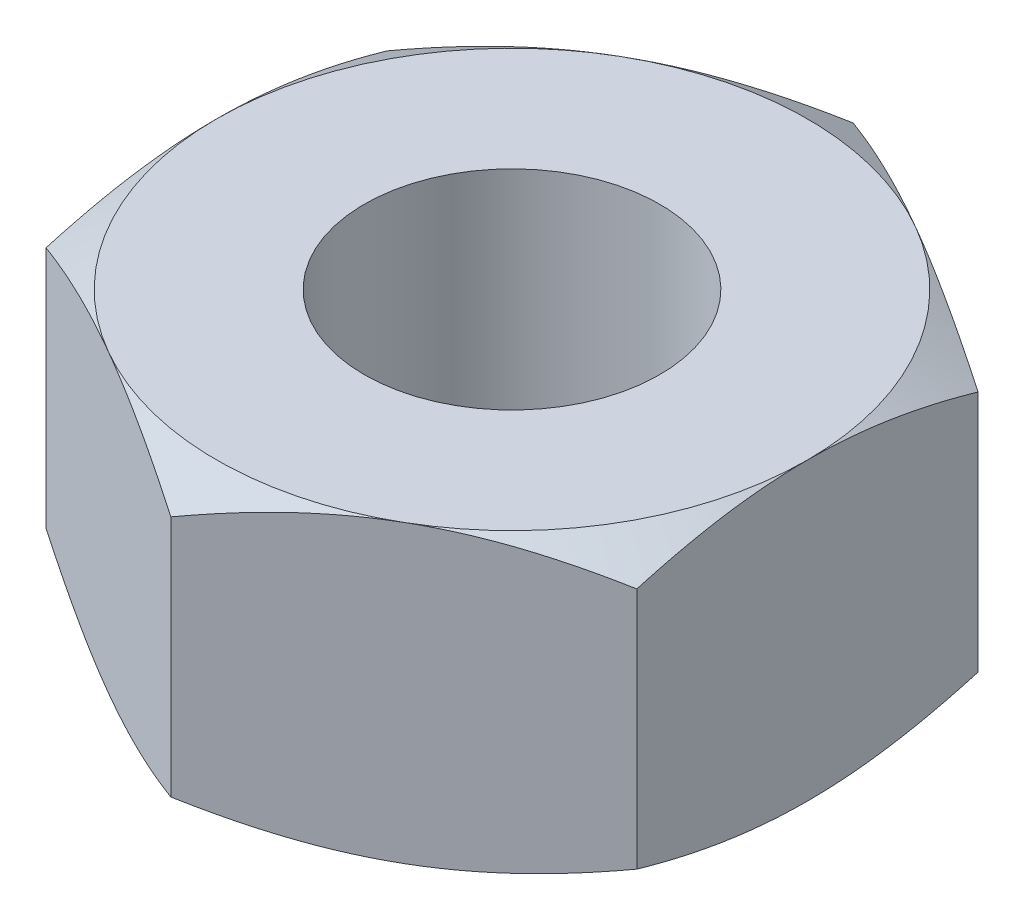
ISO-10303-21;
HEADER;
FILE_DESCRIPTION(('STEP AP214'),'2;1');
FILE_NAME('part.step','',(''),(''),'','','');
FILE_SCHEMA(('AUTOMOTIVE_DESIGN { 1 0 10303 214 1 1 1 1 }'));
ENDSEC;
DATA;
#1=APPLICATION_CONTEXT('core data for automotive mechanical design processes');
#2=APPLICATION_PROTOCOL_DEFINITION('international standard','automotive_design',2000,#1);
#3=PRODUCT_CONTEXT('',#1,'mechanical');
#4=PRODUCT('Part','Part','',(#3));
#5=PRODUCT_RELATED_PRODUCT_CATEGORY('part','',(#4));
#6=PRODUCT_DEFINITION_FORMATION('','',#4);
#7=PRODUCT_DEFINITION_CONTEXT('part definition',#1,'design');
#8=PRODUCT_DEFINITION('design','',#6,#7);
#9=PRODUCT_DEFINITION_SHAPE('','',#8);
#10=(LENGTH_UNIT() NAMED_UNIT(*) SI_UNIT(.MILLI.,.METRE.));
#11=(NAMED_UNIT(*) PLANE_ANGLE_UNIT() SI_UNIT($,.RADIAN.));
#12=(NAMED_UNIT(*) SI_UNIT($,.STERADIAN.) SOLID_ANGLE_UNIT());
#13=UNCERTAINTY_MEASURE_WITH_UNIT(LENGTH_MEASURE(1.E-05),#10,'distance_accuracy_value','');
#14=(GEOMETRIC_REPRESENTATION_CONTEXT(3) GLOBAL_UNCERTAINTY_ASSIGNED_CONTEXT((#13)) GLOBAL_UNIT_ASSIGNED_CONTEXT((#10,
#11,#12)) REPRESENTATION_CONTEXT('',''));
#15=CARTESIAN_POINT('',(0.,0.,0.));
#16=DIRECTION('',(0.,0.,1.));
#17=DIRECTION('',(1.,0.,0.));
#18=AXIS2_PLACEMENT_3D('',#15,#16,#17);
#19=CARTESIAN_POINT('',(-2.,1.,-1.15470053837926));
#20=DIRECTION('',(0.,1.,0.));
#21=DIRECTION('',(0.,0.,1.));
#22=AXIS2_PLACEMENT_3D('',#19,#20,#21);
#23=PLANE('',#22);
#24=CARTESIAN_POINT('',(0.,1.,0.));
#25=DIRECTION('',(0.,1.,0.));
#26=DIRECTION('',(0.,0.,1.));
#27=AXIS2_PLACEMENT_3D('',#24,#25,#26);
#28=CIRCLE('',#27,1.);
#29=CARTESIAN_POINT('',(0.,1.,1.));
#30=VERTEX_POINT('',#29);
#31=EDGE_CURVE('E246',#30,#30,#28,.T.);
#32=ORIENTED_EDGE('',*,*,#31,.F.);
#33=EDGE_LOOP('',(#32));
#34=FACE_BOUND('',#33,.T.);
#35=CARTESIAN_POINT('',(0.,1.,0.));
#36=DIRECTION('',(0.,1.,0.));
#37=DIRECTION('',(0.,0.,1.));
#38=AXIS2_PLACEMENT_3D('',#35,#36,#37);
#39=CIRCLE('',#38,2.);
#40=CARTESIAN_POINT('',(-0.999999999999999,1.,1.73205080756887));
#41=VERTEX_POINT('',#40);
#42=CARTESIAN_POINT('',(0.999999999999998,1.,1.73205080756887));
#43=VERTEX_POINT('',#42);
#44=EDGE_CURVE('E305',#41,#43,#39,.T.);
#45=ORIENTED_EDGE('',*,*,#44,.T.);
#46=CARTESIAN_POINT('',(2.,1.,0.));
#47=VERTEX_POINT('',#46);
#48=EDGE_CURVE('E308',#43,#47,#39,.T.);
#49=ORIENTED_EDGE('',*,*,#48,.T.);
#50=CARTESIAN_POINT('',(1.,1.,-1.73205080756888));
#51=VERTEX_POINT('',#50);
#52=EDGE_CURVE('E315',#47,#51,#39,.T.);
#53=ORIENTED_EDGE('',*,*,#52,.T.);
#54=CARTESIAN_POINT('',(-1.,1.,-1.73205080756888));
#55=VERTEX_POINT('',#54);
#56=EDGE_CURVE('E319',#51,#55,#39,.T.);
#57=ORIENTED_EDGE('',*,*,#56,.T.);
#58=CARTESIAN_POINT('',(-2.,1.,0.));
#59=VERTEX_POINT('',#58);
#60=EDGE_CURVE('E312',#55,#59,#39,.T.);
#61=ORIENTED_EDGE('',*,*,#60,.T.);
#62=EDGE_CURVE('E307',#59,#41,#39,.T.);
#63=ORIENTED_EDGE('',*,*,#62,.T.);
#64=EDGE_LOOP('',(#45,#49,#53,#57,#61,#63));
#65=FACE_BOUND('',#64,.T.);
#66=ADVANCED_FACE('F42',(#34,#65),#23,.T.);
#67=CARTESIAN_POINT('',(0.,1.,-2.30940107675851));
#68=DIRECTION('',(0.5,0.,0.866025403784439));
#69=DIRECTION('',(0.866025403784439,0.,-0.5));
#70=AXIS2_PLACEMENT_3D('',#67,#68,#69);
#71=PLANE('',#70);
#72=DIRECTION('',(0.,-1.,0.));
#73=VECTOR('',#72,1.);
#74=CARTESIAN_POINT('',(0.,1.,-2.30940107675851));
#75=LINE('',#74,#73);
#76=CARTESIAN_POINT('',(0.,0.821367205045916,-2.30940107675851));
#77=VERTEX_POINT('',#76);
#78=CARTESIAN_POINT('',(0.,-0.821367205045917,-2.30940107675851));
#79=VERTEX_POINT('',#78);
#80=EDGE_CURVE('E243',#77,#79,#75,.T.);
#81=ORIENTED_EDGE('',*,*,#80,.T.);
#82=CARTESIAN_POINT('',(0.000200000000000998,-0.8213005333795,-2.30951654681235));
#83=CARTESIAN_POINT('',(-0.0876912629000593,-0.850610463899318,-2.25877250251758));
#84=CARTESIAN_POINT('',(-0.176341194473591,-0.877267148019531,-2.20759044065996));
#85=CARTESIAN_POINT('',(-0.355176246997802,-0.923797508979276,-2.10433997494457));
#86=CARTESIAN_POINT('',(-0.445364546505037,-0.943654723617218,-2.05226973594631));
#87=CARTESIAN_POINT('',(-0.624623385763307,-0.974566535976745,-1.94877459684593));
#88=CARTESIAN_POINT('',(-0.713666338226305,-0.985826848401467,-1.89736562427198));
#89=CARTESIAN_POINT('',(-0.892171397785045,-0.999271337405356,-1.79430568008403));
#90=CARTESIAN_POINT('',(-0.98163285570396,-1.00146664504653,-1.74265508327245));
#91=CARTESIAN_POINT('',(-1.1488083535488,-0.996909010669349,-1.64613626458982));
#92=CARTESIAN_POINT('',(-1.22654737026579,-0.991275125312983,-1.60125362236173));
#93=CARTESIAN_POINT('',(-1.38151891453613,-0.97341610473917,-1.51178075956051));
#94=CARTESIAN_POINT('',(-1.4587509057412,-0.961184863976558,-1.46719084864822));
#95=CARTESIAN_POINT('',(-1.6140421864822,-0.930606563132388,-1.3775333859096));
#96=CARTESIAN_POINT('',(-1.69208181310738,-0.912129832934282,-1.33247718647009));
#97=CARTESIAN_POINT('',(-1.84699686569214,-0.870194481787143,-1.24303693915876));
#98=CARTESIAN_POINT('',(-1.92387427762312,-0.846745719507685,-1.1986517446858));
#99=CARTESIAN_POINT('',(-2.0002,-0.821300533379501,-1.15458506832542));
#100=B_SPLINE_CURVE_WITH_KNOTS('',3,(#82,#83,#84,#85,#86,#87,#88,#89,#90,#91,#92,#93,#94,#95,
#96,#97,#98,#99),.UNSPECIFIED.,.F.,.F.,(4,2,2,2,2,2,2,2,4),(0.,0.317031824695611,
0.634825876346565,0.944753967652638,1.25430138000372,1.52387047293094,1.79368946861029,
2.06949491027634,2.34475850821473),.UNSPECIFIED.);
#101=CARTESIAN_POINT('',(-1.,-1.,-1.73205080756888));
#102=VERTEX_POINT('',#101);
#103=EDGE_CURVE('E65',#79,#102,#100,.T.);
#104=ORIENTED_EDGE('',*,*,#103,.T.);
#105=CARTESIAN_POINT('',(-2.,-0.821367205045955,-1.15470053837931));
#106=VERTEX_POINT('',#105);
#107=EDGE_CURVE('E201',#102,#106,#100,.T.);
#108=ORIENTED_EDGE('',*,*,#107,.T.);
#109=DIRECTION('',(0.,-1.,0.));
#110=VECTOR('',#109,1.);
#111=CARTESIAN_POINT('',(-2.,1.,-1.15470053837926));
#112=LINE('',#111,#110);
#113=CARTESIAN_POINT('',(-2.,0.821367205045955,-1.15470053837931));
#114=VERTEX_POINT('',#113);
#115=EDGE_CURVE('E231',#114,#106,#112,.T.);
#116=ORIENTED_EDGE('',*,*,#115,.F.);
#117=CARTESIAN_POINT('',(0.00020000000000102,0.8213005333795,-2.30951654681235));
#118=CARTESIAN_POINT('',(-0.0876912629000592,0.850610463899318,-2.25877250251758));
#119=CARTESIAN_POINT('',(-0.176341194473591,0.877267148019531,-2.20759044065996));
#120=CARTESIAN_POINT('',(-0.355176246997802,0.923797508979276,-2.10433997494457));
#121=CARTESIAN_POINT('',(-0.445364546505037,0.943654723617218,-2.05226973594631));
#122=CARTESIAN_POINT('',(-0.624623385763307,0.974566535976745,-1.94877459684593));
#123=CARTESIAN_POINT('',(-0.713666338226305,0.985826848401467,-1.89736562427198));
#124=CARTESIAN_POINT('',(-0.892171397785045,0.999271337405356,-1.79430568008403));
#125=CARTESIAN_POINT('',(-0.98163285570396,1.00146664504653,-1.74265508327245));
#126=CARTESIAN_POINT('',(-1.1488083535488,0.996909010669349,-1.64613626458982));
#127=CARTESIAN_POINT('',(-1.22654737026579,0.991275125312983,-1.60125362236173));
#128=CARTESIAN_POINT('',(-1.38151891453613,0.97341610473917,-1.51178075956051));
#129=CARTESIAN_POINT('',(-1.4587509057412,0.961184863976558,-1.46719084864822));
#130=CARTESIAN_POINT('',(-1.6140421864822,0.930606563132388,-1.3775333859096));
#131=CARTESIAN_POINT('',(-1.69208181310738,0.912129832934282,-1.33247718647009));
#132=CARTESIAN_POINT('',(-1.84699686569214,0.870194481787143,-1.24303693915876));
#133=CARTESIAN_POINT('',(-1.92387427762312,0.846745719507685,-1.1986517446858));
#134=CARTESIAN_POINT('',(-2.0002,0.821300533379501,-1.15458506832542));
#135=B_SPLINE_CURVE_WITH_KNOTS('',3,(#117,#118,#119,#120,#121,#122,#123,#124,#125,#126,#127,
#128,#129,#130,#131,#132,#133,#134),.UNSPECIFIED.,.F.,.F.,(4,2,2,2,2,2,2,2,4),(0.,
0.317031824695611,0.634825876346565,0.944753967652638,1.25430138000372,1.52387047293094,
1.79368946861029,2.06949491027634,2.34475850821473),.UNSPECIFIED.);
#136=EDGE_CURVE('E253',#55,#114,#135,.T.);
#137=ORIENTED_EDGE('',*,*,#136,.F.);
#138=EDGE_CURVE('E250',#77,#55,#135,.T.);
#139=ORIENTED_EDGE('',*,*,#138,.F.);
#140=EDGE_LOOP('',(#81,#104,#108,#116,#137,#139));
#141=FACE_BOUND('',#140,.T.);
#142=ADVANCED_FACE('F44',(#141),#71,.F.);
#143=CARTESIAN_POINT('',(-2.,1.,-1.15470053837926));
#144=DIRECTION('',(1.,0.,0.));
#145=DIRECTION('',(0.,0.,-1.));
#146=AXIS2_PLACEMENT_3D('',#143,#144,#145);
#147=PLANE('',#146);
#148=ORIENTED_EDGE('',*,*,#115,.T.);
#149=CARTESIAN_POINT('',(-2.,0.00782850269269116,-3.16695367197543));
#150=CARTESIAN_POINT('',(-2.,-0.0350847066101467,-3.07902197526417));
#151=CARTESIAN_POINT('',(-2.,-0.0776048740089031,-2.99089528275371));
#152=CARTESIAN_POINT('',(-2.,-0.161639266682197,-2.81414842644908));
#153=CARTESIAN_POINT('',(-2.,-0.203153345209493,-2.72552819295827));
#154=CARTESIAN_POINT('',(-2.,-0.285150764551354,-2.54726481378446));
#155=CARTESIAN_POINT('',(-2.,-0.325627801729078,-2.45761875900125));
#156=CARTESIAN_POINT('',(-2.,-0.4050100984012,-2.27763599900541));
#157=CARTESIAN_POINT('',(-2.,-0.443915428082863,-2.18729932484827));
#158=CARTESIAN_POINT('',(-2.,-0.521055012352143,-2.00264742283372));
#159=CARTESIAN_POINT('',(-2.,-0.559219289384039,-1.90830280795077));
#160=CARTESIAN_POINT('',(-2.,-0.632806873846697,-1.71855244896372));
#161=CARTESIAN_POINT('',(-2.,-0.66823041383672,-1.62314679567917));
#162=CARTESIAN_POINT('',(-2.,-0.735465788180409,-1.43125371410594));
#163=CARTESIAN_POINT('',(-2.,-0.767284063811032,-1.33476856464363));
#164=CARTESIAN_POINT('',(-2.,-0.826327531899814,-1.1404157757171));
#165=CARTESIAN_POINT('',(-2.,-0.853554103474601,-1.04254856096068));
#166=CARTESIAN_POINT('',(-2.,-0.902005430868673,-0.845921788600811));
#167=CARTESIAN_POINT('',(-2.,-0.92326442892586,-0.74717082319717));
#168=CARTESIAN_POINT('',(-2.,-0.958624731434328,-0.548376289196548));
#169=CARTESIAN_POINT('',(-2.,-0.972726838031484,-0.448332866747867));
#170=CARTESIAN_POINT('',(-2.,-0.992463962995729,-0.2487810703752));
#171=CARTESIAN_POINT('',(-2.,-0.998212859713922,-0.149284287500367));
#172=CARTESIAN_POINT('',(-2.,-1.00107345626729,0.0498326704758035));
#173=CARTESIAN_POINT('',(-2.,-0.998185065558036,0.14945284685973));
#174=CARTESIAN_POINT('',(-2.,-0.981412672765417,0.384622843357507));
#175=CARTESIAN_POINT('',(-2.,-0.963876061108788,0.519914836095747));
#176=CARTESIAN_POINT('',(-2.,-0.915774754457482,0.788159784938833));
#177=CARTESIAN_POINT('',(-2.,-0.885198581528369,0.921110572606413));
#178=CARTESIAN_POINT('',(-2.,-0.813574728441902,1.18747685717518));
#179=CARTESIAN_POINT('',(-2.,-0.772295893905814,1.320828590886));
#180=CARTESIAN_POINT('',(-2.,-0.705048606127055,1.51898260167282));
#181=CARTESIAN_POINT('',(-2.,-0.681746361744957,1.58471745406577));
#182=CARTESIAN_POINT('',(-2.,-0.633642247327276,1.71563585585812));
#183=CARTESIAN_POINT('',(-2.,-0.608840415594644,1.78081941929029));
#184=CARTESIAN_POINT('',(-2.,-0.538498959828225,1.96047132737881));
#185=CARTESIAN_POINT('',(-2.,-0.49163529791176,2.07442009684161));
#186=CARTESIAN_POINT('',(-2.,-0.395039041663509,2.30109986654162));
#187=CARTESIAN_POINT('',(-2.,-0.345306102259939,2.41383071836308));
#188=CARTESIAN_POINT('',(-2.,-0.24367241595586,2.63836009784248));
#189=CARTESIAN_POINT('',(-2.,-0.1917708359149,2.75015824701849));
#190=CARTESIAN_POINT('',(-2.,-0.0863239583266315,2.97297822080944));
#191=CARTESIAN_POINT('',(-2.,-0.0327786070291115,3.08400001989219));
#192=CARTESIAN_POINT('',(-2.,0.129928912442797,3.41651309377542));
#193=CARTESIAN_POINT('',(-2.,0.24098839062516,3.63707460518762));
#194=CARTESIAN_POINT('',(-2.,0.466233205474768,4.07651788965889));
#195=CARTESIAN_POINT('',(-2.,0.580417810236838,4.29540004090732));
#196=CARTESIAN_POINT('',(-2.,0.798195573812074,4.70796742449767));
#197=CARTESIAN_POINT('',(-2.,0.901568046895778,4.90176934503598));
#198=CARTESIAN_POINT('',(-2.,1.10953519768183,5.28873234168864));
#199=CARTESIAN_POINT('',(-2.,1.21412995879867,5.48189337289715));
#200=CARTESIAN_POINT('',(-2.,1.42384733635443,5.86703603383661));
#201=CARTESIAN_POINT('',(-2.,1.52896674297787,6.05901941340967));
#202=CARTESIAN_POINT('',(-2.,1.73989383988691,6.44258645794321));
#203=CARTESIAN_POINT('',(-2.,1.84570147050148,6.63417015570406));
#204=CARTESIAN_POINT('',(-2.,1.951758468002,6.82561474984265));
#205=B_SPLINE_CURVE_WITH_KNOTS('',3,(#149,#150,#151,#152,#153,#154,#155,#156,#157,#158,#159,
#160,#161,#162,#163,#164,#165,#166,#167,#168,#169,#170,#171,#172,#173,#174,#175,#176,#177,#178,
#179,#180,#181,#182,#183,#184,#185,#186,#187,#188,#189,#190,#191,#192,#193,#194,#195,#196,#197,
#198,#199,#200,#201,#202,#203,#204),.UNSPECIFIED.,.F.,.F.,(4,2,2,2,2,2,2,2,2,2,2,2,2,2,2,2,2,2,
2,2,2,2,2,2,2,2,2,4),(0.,0.293536488763143,0.587115537909026,0.88218519250617,1.17724165566856,
1.48252306859444,1.78777854905824,2.09247975206599,2.39708927456179,2.69991343430838,
3.00270364596081,3.30132591731421,3.59995131912688,4.00838273527676,4.41717441329802,
4.83566143161901,5.04487769482539,5.25408861641711,5.62365791707084,5.99327175676164,
6.36302892297546,6.73279819290498,7.47358342922537,8.21419663356501,8.87313329090316,
9.5321151827856,10.1887484805853,10.8453255857258),.UNSPECIFIED.);
#206=CARTESIAN_POINT('',(-2.,-1.,0.));
#207=VERTEX_POINT('',#206);
#208=EDGE_CURVE('E286',#106,#207,#205,.T.);
#209=ORIENTED_EDGE('',*,*,#208,.T.);
#210=CARTESIAN_POINT('',(-2.,-0.821367205045921,1.15470053837925));
#211=VERTEX_POINT('',#210);
#212=EDGE_CURVE('E280',#207,#211,#205,.T.);
#213=ORIENTED_EDGE('',*,*,#212,.T.);
#214=DIRECTION('',(0.,-1.,0.));
#215=VECTOR('',#214,1.);
#216=CARTESIAN_POINT('',(-2.,1.,1.15470053837925));
#217=LINE('',#216,#215);
#218=CARTESIAN_POINT('',(-2.,0.821367205045921,1.15470053837925));
#219=VERTEX_POINT('',#218);
#220=EDGE_CURVE('E234',#219,#211,#217,.T.);
#221=ORIENTED_EDGE('',*,*,#220,.F.);
#222=CARTESIAN_POINT('',(-2.,-0.00782850269269116,-3.16695367197543));
#223=CARTESIAN_POINT('',(-2.,0.0350847066101467,-3.07902197526417));
#224=CARTESIAN_POINT('',(-2.,0.0776048740089031,-2.99089528275371));
#225=CARTESIAN_POINT('',(-2.,0.161639266682197,-2.81414842644908));
#226=CARTESIAN_POINT('',(-2.,0.203153345209493,-2.72552819295827));
#227=CARTESIAN_POINT('',(-2.,0.285150764551354,-2.54726481378446));
#228=CARTESIAN_POINT('',(-2.,0.325627801729078,-2.45761875900125));
#229=CARTESIAN_POINT('',(-2.,0.4050100984012,-2.27763599900541));
#230=CARTESIAN_POINT('',(-2.,0.443915428082863,-2.18729932484827));
#231=CARTESIAN_POINT('',(-2.,0.521055012352143,-2.00264742283372));
#232=CARTESIAN_POINT('',(-2.,0.559219289384039,-1.90830280795077));
#233=CARTESIAN_POINT('',(-2.,0.632806873846697,-1.71855244896372));
#234=CARTESIAN_POINT('',(-2.,0.66823041383672,-1.62314679567917));
#235=CARTESIAN_POINT('',(-2.,0.735465788180409,-1.43125371410594));
#236=CARTESIAN_POINT('',(-2.,0.767284063811032,-1.33476856464363));
#237=CARTESIAN_POINT('',(-2.,0.826327531899814,-1.1404157757171));
#238=CARTESIAN_POINT('',(-2.,0.853554103474601,-1.04254856096068));
#239=CARTESIAN_POINT('',(-2.,0.902005430868673,-0.845921788600811));
#240=CARTESIAN_POINT('',(-2.,0.92326442892586,-0.74717082319717));
#241=CARTESIAN_POINT('',(-2.,0.958624731434328,-0.548376289196548));
#242=CARTESIAN_POINT('',(-2.,0.972726838031484,-0.448332866747867));
#243=CARTESIAN_POINT('',(-2.,0.992463962995729,-0.2487810703752));
#244=CARTESIAN_POINT('',(-2.,0.998212859713922,-0.149284287500367));
#245=CARTESIAN_POINT('',(-2.,1.00107345626729,0.0498326704758035));
#246=CARTESIAN_POINT('',(-2.,0.998185065558036,0.14945284685973));
#247=CARTESIAN_POINT('',(-2.,0.981412672765417,0.384622843357507));
#248=CARTESIAN_POINT('',(-2.,0.963876061108788,0.519914836095747));
#249=CARTESIAN_POINT('',(-2.,0.915774754457482,0.788159784938833));
#250=CARTESIAN_POINT('',(-2.,0.885198581528369,0.921110572606413));
#251=CARTESIAN_POINT('',(-2.,0.813574728441902,1.18747685717518));
#252=CARTESIAN_POINT('',(-2.,0.772295893905814,1.320828590886));
#253=CARTESIAN_POINT('',(-2.,0.705048606127055,1.51898260167282));
#254=CARTESIAN_POINT('',(-2.,0.681746361744957,1.58471745406577));
#255=CARTESIAN_POINT('',(-2.,0.633642247327276,1.71563585585812));
#256=CARTESIAN_POINT('',(-2.,0.608840415594644,1.78081941929029));
#257=CARTESIAN_POINT('',(-2.,0.538498959828225,1.96047132737881));
#258=CARTESIAN_POINT('',(-2.,0.49163529791176,2.07442009684161));
#259=CARTESIAN_POINT('',(-2.,0.395039041663509,2.30109986654162));
#260=CARTESIAN_POINT('',(-2.,0.345306102259939,2.41383071836308));
#261=CARTESIAN_POINT('',(-2.,0.24367241595586,2.63836009784248));
#262=CARTESIAN_POINT('',(-2.,0.1917708359149,2.75015824701849));
#263=CARTESIAN_POINT('',(-2.,0.0863239583266315,2.97297822080944));
#264=CARTESIAN_POINT('',(-2.,0.0327786070291115,3.08400001989219));
#265=CARTESIAN_POINT('',(-2.,-0.129928912442797,3.41651309377542));
#266=CARTESIAN_POINT('',(-2.,-0.24098839062516,3.63707460518762));
#267=CARTESIAN_POINT('',(-2.,-0.466233205474768,4.07651788965889));
#268=CARTESIAN_POINT('',(-2.,-0.580417810236838,4.29540004090732));
#269=CARTESIAN_POINT('',(-2.,-0.798195573812074,4.70796742449767));
#270=CARTESIAN_POINT('',(-2.,-0.901568046895778,4.90176934503598));
#271=CARTESIAN_POINT('',(-2.,-1.10953519768183,5.28873234168864));
#272=CARTESIAN_POINT('',(-2.,-1.21412995879867,5.48189337289715));
#273=CARTESIAN_POINT('',(-2.,-1.42384733635443,5.86703603383661));
#274=CARTESIAN_POINT('',(-2.,-1.52896674297787,6.05901941340967));
#275=CARTESIAN_POINT('',(-2.,-1.73989383988691,6.44258645794321));
#276=CARTESIAN_POINT('',(-2.,-1.84570147050148,6.63417015570406));
#277=CARTESIAN_POINT('',(-2.,-1.951758468002,6.82561474984265));
#278=B_SPLINE_CURVE_WITH_KNOTS('',3,(#222,#223,#224,#225,#226,#227,#228,#229,#230,#231,#232,
#233,#234,#235,#236,#237,#238,#239,#240,#241,#242,#243,#244,#245,#246,#247,#248,#249,#250,#251,
#252,#253,#254,#255,#256,#257,#258,#259,#260,#261,#262,#263,#264,#265,#266,#267,#268,#269,#270,
#271,#272,#273,#274,#275,#276,#277),.UNSPECIFIED.,.F.,.F.,(4,2,2,2,2,2,2,2,2,2,2,2,2,2,2,2,2,2,
2,2,2,2,2,2,2,2,2,4),(0.,0.293536488763143,0.587115537909026,0.88218519250617,1.17724165566856,
1.48252306859444,1.78777854905824,2.09247975206599,2.39708927456179,2.69991343430838,
3.00270364596081,3.30132591731421,3.59995131912688,4.00838273527676,4.41717441329802,
4.83566143161901,5.04487769482539,5.25408861641711,5.62365791707084,5.99327175676164,
6.36302892297546,6.73279819290498,7.47358342922537,8.21419663356501,8.87313329090316,
9.5321151827856,10.1887484805853,10.8453255857258),.UNSPECIFIED.);
#279=EDGE_CURVE('E260',#59,#219,#278,.T.);
#280=ORIENTED_EDGE('',*,*,#279,.F.);
#281=EDGE_CURVE('E259',#114,#59,#278,.T.);
#282=ORIENTED_EDGE('',*,*,#281,.F.);
#283=EDGE_LOOP('',(#148,#209,#213,#221,#280,#282));
#284=FACE_BOUND('',#283,.T.);
#285=ADVANCED_FACE('F273',(#284),#147,.F.);
#286=CARTESIAN_POINT('',(-2.,1.,1.15470053837925));
#287=DIRECTION('',(0.5,0.,-0.866025403784439));
#288=DIRECTION('',(-0.866025403784439,0.,-0.5));
#289=AXIS2_PLACEMENT_3D('',#286,#287,#288);
#290=PLANE('',#289);
#291=ORIENTED_EDGE('',*,*,#220,.T.);
#292=CARTESIAN_POINT('',(-2.0002,-0.821300533379504,1.15458506832541));
#293=CARTESIAN_POINT('',(-1.91230873709994,-0.850610463899323,1.20532911262017));
#294=CARTESIAN_POINT('',(-1.82365880552641,-0.877267148019535,1.25651117447779));
#295=CARTESIAN_POINT('',(-1.6448237530022,-0.923797508979281,1.35976164019319));
#296=CARTESIAN_POINT('',(-1.55463545349497,-0.943654723617223,1.41183187919144));
#297=CARTESIAN_POINT('',(-1.3753766142367,-0.97456653597675,1.51532701829183));
#298=CARTESIAN_POINT('',(-1.2863336617737,-0.985826848401471,1.56673599086578));
#299=CARTESIAN_POINT('',(-1.10782860221496,-0.999271337405361,1.66979593505372));
#300=CARTESIAN_POINT('',(-1.01836714429604,-1.00146664504653,1.72144653186531));
#301=CARTESIAN_POINT('',(-0.851191646451205,-0.996909010669355,1.81796535054793));
#302=CARTESIAN_POINT('',(-0.773452629734219,-0.991275125312989,1.86284799277602));
#303=CARTESIAN_POINT('',(-0.618481085463869,-0.973416104739175,1.95232085557724));
#304=CARTESIAN_POINT('',(-0.541249094258804,-0.961184863976564,1.99691076648954));
#305=CARTESIAN_POINT('',(-0.385957813517802,-0.930606563132394,2.08656822922816));
#306=CARTESIAN_POINT('',(-0.307918186892623,-0.912129832934288,2.13162442866766));
#307=CARTESIAN_POINT('',(-0.153003134307868,-0.870194481787148,2.221064675979));
#308=CARTESIAN_POINT('',(-0.0761257223768825,-0.846745719507691,2.26544987045195));
#309=CARTESIAN_POINT('',(0.000199999999997648,-0.821300533379506,2.30951654681234));
#310=B_SPLINE_CURVE_WITH_KNOTS('',3,(#292,#293,#294,#295,#296,#297,#298,#299,#300,#301,#302,
#303,#304,#305,#306,#307,#308,#309),.UNSPECIFIED.,.F.,.F.,(4,2,2,2,2,2,2,2,4),(0.,
0.31703182469561,0.634825876346563,0.944753967652635,1.25430138000371,1.52387047293094,
1.79368946861028,2.06949491027634,2.34475850821472),.UNSPECIFIED.);
#311=CARTESIAN_POINT('',(-1.,-1.,1.73205080756888));
#312=VERTEX_POINT('',#311);
#313=EDGE_CURVE('E166',#211,#312,#310,.T.);
#314=ORIENTED_EDGE('',*,*,#313,.T.);
#315=CARTESIAN_POINT('',(0.,-0.821367205045923,2.3094010767585));
#316=VERTEX_POINT('',#315);
#317=EDGE_CURVE('E150',#312,#316,#310,.T.);
#318=ORIENTED_EDGE('',*,*,#317,.T.);
#319=DIRECTION('',(0.,-1.,0.));
#320=VECTOR('',#319,1.);
#321=CARTESIAN_POINT('',(0.,1.,2.3094010767585));
#322=LINE('',#321,#320);
#323=CARTESIAN_POINT('',(0.,0.821367205045923,2.3094010767585));
#324=VERTEX_POINT('',#323);
#325=EDGE_CURVE('E165',#324,#316,#322,.T.);
#326=ORIENTED_EDGE('',*,*,#325,.F.);
#327=CARTESIAN_POINT('',(-2.0002,0.821300533379504,1.15458506832541));
#328=CARTESIAN_POINT('',(-1.91230873709994,0.850610463899323,1.20532911262017));
#329=CARTESIAN_POINT('',(-1.82365880552641,0.877267148019535,1.25651117447779));
#330=CARTESIAN_POINT('',(-1.6448237530022,0.923797508979281,1.35976164019319));
#331=CARTESIAN_POINT('',(-1.55463545349497,0.943654723617223,1.41183187919144));
#332=CARTESIAN_POINT('',(-1.3753766142367,0.97456653597675,1.51532701829183));
#333=CARTESIAN_POINT('',(-1.2863336617737,0.985826848401471,1.56673599086578));
#334=CARTESIAN_POINT('',(-1.10782860221496,0.999271337405361,1.66979593505372));
#335=CARTESIAN_POINT('',(-1.01836714429604,1.00146664504653,1.72144653186531));
#336=CARTESIAN_POINT('',(-0.851191646451205,0.996909010669355,1.81796535054793));
#337=CARTESIAN_POINT('',(-0.773452629734219,0.991275125312989,1.86284799277602));
#338=CARTESIAN_POINT('',(-0.618481085463869,0.973416104739175,1.95232085557724));
#339=CARTESIAN_POINT('',(-0.541249094258804,0.961184863976564,1.99691076648954));
#340=CARTESIAN_POINT('',(-0.385957813517802,0.930606563132394,2.08656822922816));
#341=CARTESIAN_POINT('',(-0.307918186892623,0.912129832934288,2.13162442866766));
#342=CARTESIAN_POINT('',(-0.153003134307868,0.870194481787148,2.221064675979));
#343=CARTESIAN_POINT('',(-0.0761257223768825,0.846745719507691,2.26544987045195));
#344=CARTESIAN_POINT('',(0.000199999999997648,0.821300533379506,2.30951654681234));
#345=B_SPLINE_CURVE_WITH_KNOTS('',3,(#327,#328,#329,#330,#331,#332,#333,#334,#335,#336,#337,
#338,#339,#340,#341,#342,#343,#344),.UNSPECIFIED.,.F.,.F.,(4,2,2,2,2,2,2,2,4),(0.,
0.31703182469561,0.634825876346563,0.944753967652635,1.25430138000371,1.52387047293094,
1.79368946861028,2.06949491027634,2.34475850821472),.UNSPECIFIED.);
#346=EDGE_CURVE('E267',#41,#324,#345,.T.);
#347=ORIENTED_EDGE('',*,*,#346,.F.);
#348=EDGE_CURVE('E266',#219,#41,#345,.T.);
#349=ORIENTED_EDGE('',*,*,#348,.F.);
#350=EDGE_LOOP('',(#291,#314,#318,#326,#347,#349));
#351=FACE_BOUND('',#350,.T.);
#352=ADVANCED_FACE('F276',(#351),#290,.F.);
#353=CARTESIAN_POINT('',(0.,1.,2.3094010767585));
#354=DIRECTION('',(-0.5,0.,-0.866025403784438));
#355=DIRECTION('',(-0.866025403784439,0.,0.5));
#356=AXIS2_PLACEMENT_3D('',#353,#354,#355);
#357=PLANE('',#356);
#358=ORIENTED_EDGE('',*,*,#325,.T.);
#359=CARTESIAN_POINT('',(-0.000200000000002104,-0.821300533379506,2.30951654681234));
#360=CARTESIAN_POINT('',(0.0876912629000577,-0.850610463899325,2.25877250251757));
#361=CARTESIAN_POINT('',(0.176341194473589,-0.877267148019537,2.20759044065995));
#362=CARTESIAN_POINT('',(0.355176246997799,-0.923797508979283,2.10433997494456));
#363=CARTESIAN_POINT('',(0.445364546505033,-0.943654723617225,2.0522697359463));
#364=CARTESIAN_POINT('',(0.624623385763302,-0.974566535976751,1.94877459684592));
#365=CARTESIAN_POINT('',(0.7136663382263,-0.985826848401472,1.89736562427197));
#366=CARTESIAN_POINT('',(0.892171397785039,-0.999271337405362,1.79430568008402));
#367=CARTESIAN_POINT('',(0.981632855703954,-1.00146664504654,1.74265508327244));
#368=CARTESIAN_POINT('',(1.14880835354879,-0.996909010669355,1.64613626458981));
#369=CARTESIAN_POINT('',(1.22654737026578,-0.991275125312989,1.60125362236172));
#370=CARTESIAN_POINT('',(1.38151891453613,-0.973416104739175,1.5117807595605));
#371=CARTESIAN_POINT('',(1.45875090574119,-0.961184863976565,1.46719084864821));
#372=CARTESIAN_POINT('',(1.6140421864822,-0.930606563132394,1.37753338590959));
#373=CARTESIAN_POINT('',(1.69208181310738,-0.912129832934288,1.33247718647008));
#374=CARTESIAN_POINT('',(1.84699686569213,-0.870194481787148,1.24303693915875));
#375=CARTESIAN_POINT('',(1.92387427762312,-0.84674571950769,1.19865174468579));
#376=CARTESIAN_POINT('',(2.0002,-0.821300533379506,1.15458506832541));
#377=B_SPLINE_CURVE_WITH_KNOTS('',3,(#359,#360,#361,#362,#363,#364,#365,#366,#367,#368,#369,
#370,#371,#372,#373,#374,#375,#376),.UNSPECIFIED.,.F.,.F.,(4,2,2,2,2,2,2,2,4),(0.,
0.317031824695609,0.634825876346562,0.944753967652634,1.25430138000371,1.52387047293094,
1.79368946861028,2.06949491027634,2.34475850821472),.UNSPECIFIED.);
#378=CARTESIAN_POINT('',(1.,-1.,1.73205080756888));
#379=VERTEX_POINT('',#378);
#380=EDGE_CURVE('E144',#316,#379,#377,.T.);
#381=ORIENTED_EDGE('',*,*,#380,.T.);
#382=CARTESIAN_POINT('',(2.,-0.821367205045922,1.15470053837925));
#383=VERTEX_POINT('',#382);
#384=EDGE_CURVE('E132',#379,#383,#377,.T.);
#385=ORIENTED_EDGE('',*,*,#384,.T.);
#386=DIRECTION('',(0.,-1.,0.));
#387=VECTOR('',#386,1.);
#388=CARTESIAN_POINT('',(2.,1.,1.15470053837925));
#389=LINE('',#388,#387);
#390=CARTESIAN_POINT('',(2.,0.821367205045922,1.15470053837925));
#391=VERTEX_POINT('',#390);
#392=EDGE_CURVE('E238',#391,#383,#389,.T.);
#393=ORIENTED_EDGE('',*,*,#392,.F.);
#394=CARTESIAN_POINT('',(-0.000200000000002104,0.821300533379506,2.30951654681234));
#395=CARTESIAN_POINT('',(0.0876912629000577,0.850610463899325,2.25877250251757));
#396=CARTESIAN_POINT('',(0.176341194473589,0.877267148019537,2.20759044065995));
#397=CARTESIAN_POINT('',(0.355176246997799,0.923797508979283,2.10433997494456));
#398=CARTESIAN_POINT('',(0.445364546505033,0.943654723617225,2.0522697359463));
#399=CARTESIAN_POINT('',(0.624623385763302,0.974566535976751,1.94877459684592));
#400=CARTESIAN_POINT('',(0.7136663382263,0.985826848401472,1.89736562427197));
#401=CARTESIAN_POINT('',(0.892171397785039,0.999271337405362,1.79430568008402));
#402=CARTESIAN_POINT('',(0.981632855703954,1.00146664504654,1.74265508327244));
#403=CARTESIAN_POINT('',(1.14880835354879,0.996909010669355,1.64613626458981));
#404=CARTESIAN_POINT('',(1.22654737026578,0.991275125312989,1.60125362236172));
#405=CARTESIAN_POINT('',(1.38151891453613,0.973416104739175,1.5117807595605));
#406=CARTESIAN_POINT('',(1.45875090574119,0.961184863976565,1.46719084864821));
#407=CARTESIAN_POINT('',(1.6140421864822,0.930606563132394,1.37753338590959));
#408=CARTESIAN_POINT('',(1.69208181310738,0.912129832934288,1.33247718647008));
#409=CARTESIAN_POINT('',(1.84699686569213,0.870194481787148,1.24303693915875));
#410=CARTESIAN_POINT('',(1.92387427762312,0.84674571950769,1.19865174468579));
#411=CARTESIAN_POINT('',(2.0002,0.821300533379506,1.15458506832541));
#412=B_SPLINE_CURVE_WITH_KNOTS('',3,(#394,#395,#396,#397,#398,#399,#400,#401,#402,#403,#404,
#405,#406,#407,#408,#409,#410,#411),.UNSPECIFIED.,.F.,.F.,(4,2,2,2,2,2,2,2,4),(0.,
0.317031824695609,0.634825876346562,0.944753967652634,1.25430138000371,1.52387047293094,
1.79368946861028,2.06949491027634,2.34475850821472),.UNSPECIFIED.);
#413=EDGE_CURVE('E337',#43,#391,#412,.T.);
#414=ORIENTED_EDGE('',*,*,#413,.F.);
#415=EDGE_CURVE('E339',#324,#43,#412,.T.);
#416=ORIENTED_EDGE('',*,*,#415,.F.);
#417=EDGE_LOOP('',(#358,#381,#385,#393,#414,#416));
#418=FACE_BOUND('',#417,.T.);
#419=ADVANCED_FACE('F162',(#418),#357,.F.);
#420=CARTESIAN_POINT('',(2.,1.,1.15470053837925));
#421=DIRECTION('',(-1.,0.,0.));
#422=DIRECTION('',(0.,0.,1.));
#423=AXIS2_PLACEMENT_3D('',#420,#421,#422);
#424=PLANE('',#423);
#425=ORIENTED_EDGE('',*,*,#392,.T.);
#426=CARTESIAN_POINT('',(2.,0.00782850062822909,-3.16695366774633));
#427=CARTESIAN_POINT('',(2.,-0.0350847085887405,-3.07902197117755));
#428=CARTESIAN_POINT('',(2.,-0.0776048759016788,-2.99089527880968));
#429=CARTESIAN_POINT('',(2.,-0.161639268403751,-2.81414842279064));
#430=CARTESIAN_POINT('',(2.,-0.203153346845644,-2.72552818944285));
#431=CARTESIAN_POINT('',(2.,-0.28515076601667,-2.54726481055716));
#432=CARTESIAN_POINT('',(2.,-0.325627803108976,-2.45761875591908));
#433=CARTESIAN_POINT('',(2.,-0.405010099611657,-2.27763599621445));
#434=CARTESIAN_POINT('',(2.,-0.443915429209295,-2.1872993222034));
#435=CARTESIAN_POINT('',(2.,-0.521055013307717,-2.002647420493));
#436=CARTESIAN_POINT('',(2.,-0.559219290252985,-1.90830280576822));
#437=CARTESIAN_POINT('',(2.,-0.632806874546963,-1.71855244709993));
#438=CARTESIAN_POINT('',(2.,-0.668230414454932,-1.62314679397598));
#439=CARTESIAN_POINT('',(2.,-0.735465788642179,-1.43125371272692));
#440=CARTESIAN_POINT('',(2.,-0.767284064198393,-1.33476856342819));
#441=CARTESIAN_POINT('',(2.,-0.82632753215024,-1.14041577483321));
#442=CARTESIAN_POINT('',(2.,-0.853554103662493,-1.04254856024476));
#443=CARTESIAN_POINT('',(2.,-0.902005430930091,-0.845921788305319));
#444=CARTESIAN_POINT('',(2.,-0.923264428927965,-0.747170823155284));
#445=CARTESIAN_POINT('',(2.,-0.958624731355776,-0.548376289668177));
#446=CARTESIAN_POINT('',(2.,-0.972726837931557,-0.448332867479402));
#447=CARTESIAN_POINT('',(2.,-0.992463962899518,-0.248781071622364));
#448=CARTESIAN_POINT('',(2.,-0.99821285964192,-0.149284289003197));
#449=CARTESIAN_POINT('',(2.,-1.00107345628888,0.0498326684653402));
#450=CARTESIAN_POINT('',(2.,-0.998185065649016,0.149452844597298));
#451=CARTESIAN_POINT('',(2.,-0.981412673049799,0.384622840715321));
#452=CARTESIAN_POINT('',(2.,-0.963876061509465,0.519914833328));
#453=CARTESIAN_POINT('',(2.,-0.915774755093465,0.788159781929809));
#454=CARTESIAN_POINT('',(2.,-0.885198582283388,0.921110569481685));
#455=CARTESIAN_POINT('',(2.,-0.813574729432064,1.18747685381783));
#456=CARTESIAN_POINT('',(2.,-0.772295895012158,1.32082858741191));
#457=CARTESIAN_POINT('',(2.,-0.705048607401325,1.5189825980245));
#458=CARTESIAN_POINT('',(2.,-0.681746363074102,1.58471745035964));
#459=CARTESIAN_POINT('',(2.,-0.633642248764179,1.71563585203636));
#460=CARTESIAN_POINT('',(2.,-0.608840417084432,1.78081941541071));
#461=CARTESIAN_POINT('',(2.,-0.5384989614111,1.96047132346851));
#462=CARTESIAN_POINT('',(2.,-0.49163529952849,2.07442009295651));
#463=CARTESIAN_POINT('',(2.,-0.39503904333779,2.3010998627036));
#464=CARTESIAN_POINT('',(2.,-0.345306103957911,2.41383071454693));
#465=CARTESIAN_POINT('',(2.,-0.24367241769394,2.63836009406773));
#466=CARTESIAN_POINT('',(2.,-0.19177083766939,2.75015824326324));
#467=CARTESIAN_POINT('',(2.,-0.0863239601088208,2.97297821709112));
#468=CARTESIAN_POINT('',(2.,-0.0327786088225907,3.0840000161913));
#469=CARTESIAN_POINT('',(2.,0.129928910621969,3.41651309012671));
#470=CARTESIAN_POINT('',(2.,0.240988388793805,3.63707460157126));
#471=CARTESIAN_POINT('',(2.,0.466233203630108,4.07651788610303));
#472=CARTESIAN_POINT('',(2.,0.580417808389395,4.29540003737962));
#473=CARTESIAN_POINT('',(2.,0.798195571951464,4.70796742099752));
#474=CARTESIAN_POINT('',(2.,0.901568045024093,4.90176934153558));
#475=CARTESIAN_POINT('',(2.,1.10953519579024,5.2887323381867));
#476=CARTESIAN_POINT('',(2.,1.21412995689826,5.48189336939392));
#477=CARTESIAN_POINT('',(2.,1.42384733443566,5.86703603032595));
#478=CARTESIAN_POINT('',(2.,1.52896674104953,6.05901940989288));
#479=CARTESIAN_POINT('',(2.,1.73989383794044,6.44258645441348));
#480=CARTESIAN_POINT('',(2.,1.84570146854644,6.63417015216754));
#481=CARTESIAN_POINT('',(2.,1.95175846603871,6.82561474629916));
#482=B_SPLINE_CURVE_WITH_KNOTS('',3,(#426,#427,#428,#429,#430,#431,#432,#433,#434,#435,#436,
#437,#438,#439,#440,#441,#442,#443,#444,#445,#446,#447,#448,#449,#450,#451,#452,#453,#454,#455,
#456,#457,#458,#459,#460,#461,#462,#463,#464,#465,#466,#467,#468,#469,#470,#471,#472,#473,#474,
#475,#476,#477,#478,#479,#480,#481),.UNSPECIFIED.,.F.,.F.,(4,2,2,2,2,2,2,2,2,2,2,2,2,2,2,2,2,2,
2,2,2,2,2,2,2,2,2,4),(0.,0.293536488266007,0.587115536914683,0.882185191009572,1.17724165366974,
1.48252306605832,1.78777854598491,2.09247974845699,2.39708927041753,2.69991342938452,
3.00270364025849,3.30132591085335,3.59995131190718,4.00838272763915,4.41717440524141,
4.83566142312397,5.0448776861118,5.25408860748496,5.62365790816955,5.99327174789154,
6.36302891413759,6.73279818409942,7.47358342049203,8.21419662490265,8.87313328222447,
9.53211517409089,10.1887484718607,10.8453255769709),.UNSPECIFIED.);
#483=CARTESIAN_POINT('',(2.,-1.,0.));
#484=VERTEX_POINT('',#483);
#485=EDGE_CURVE('E139',#383,#484,#482,.F.);
#486=ORIENTED_EDGE('',*,*,#485,.T.);
#487=CARTESIAN_POINT('',(2.,-0.821367205045919,-1.15470053837926));
#488=VERTEX_POINT('',#487);
#489=EDGE_CURVE('E175',#484,#488,#482,.F.);
#490=ORIENTED_EDGE('',*,*,#489,.T.);
#491=DIRECTION('',(0.,-1.,0.));
#492=VECTOR('',#491,1.);
#493=CARTESIAN_POINT('',(2.,1.,-1.15470053837926));
#494=LINE('',#493,#492);
#495=CARTESIAN_POINT('',(2.,0.821367205045919,-1.15470053837926));
#496=VERTEX_POINT('',#495);
#497=EDGE_CURVE('E240',#496,#488,#494,.T.);
#498=ORIENTED_EDGE('',*,*,#497,.F.);
#499=CARTESIAN_POINT('',(2.,-0.00782850062822909,-3.16695366774633));
#500=CARTESIAN_POINT('',(2.,0.0350847085887405,-3.07902197117755));
#501=CARTESIAN_POINT('',(2.,0.0776048759016788,-2.99089527880968));
#502=CARTESIAN_POINT('',(2.,0.161639268403751,-2.81414842279064));
#503=CARTESIAN_POINT('',(2.,0.203153346845644,-2.72552818944285));
#504=CARTESIAN_POINT('',(2.,0.28515076601667,-2.54726481055716));
#505=CARTESIAN_POINT('',(2.,0.325627803108976,-2.45761875591908));
#506=CARTESIAN_POINT('',(2.,0.405010099611657,-2.27763599621445));
#507=CARTESIAN_POINT('',(2.,0.443915429209295,-2.1872993222034));
#508=CARTESIAN_POINT('',(2.,0.521055013307717,-2.002647420493));
#509=CARTESIAN_POINT('',(2.,0.559219290252985,-1.90830280576822));
#510=CARTESIAN_POINT('',(2.,0.632806874546963,-1.71855244709993));
#511=CARTESIAN_POINT('',(2.,0.668230414454932,-1.62314679397598));
#512=CARTESIAN_POINT('',(2.,0.735465788642179,-1.43125371272692));
#513=CARTESIAN_POINT('',(2.,0.767284064198393,-1.33476856342819));
#514=CARTESIAN_POINT('',(2.,0.82632753215024,-1.14041577483321));
#515=CARTESIAN_POINT('',(2.,0.853554103662493,-1.04254856024476));
#516=CARTESIAN_POINT('',(2.,0.902005430930091,-0.845921788305319));
#517=CARTESIAN_POINT('',(2.,0.923264428927965,-0.747170823155284));
#518=CARTESIAN_POINT('',(2.,0.958624731355776,-0.548376289668177));
#519=CARTESIAN_POINT('',(2.,0.972726837931557,-0.448332867479402));
#520=CARTESIAN_POINT('',(2.,0.992463962899518,-0.248781071622364));
#521=CARTESIAN_POINT('',(2.,0.99821285964192,-0.149284289003197));
#522=CARTESIAN_POINT('',(2.,1.00107345628888,0.0498326684653402));
#523=CARTESIAN_POINT('',(2.,0.998185065649016,0.149452844597298));
#524=CARTESIAN_POINT('',(2.,0.981412673049799,0.384622840715321));
#525=CARTESIAN_POINT('',(2.,0.963876061509465,0.519914833328));
#526=CARTESIAN_POINT('',(2.,0.915774755093465,0.788159781929809));
#527=CARTESIAN_POINT('',(2.,0.885198582283388,0.921110569481685));
#528=CARTESIAN_POINT('',(2.,0.813574729432064,1.18747685381783));
#529=CARTESIAN_POINT('',(2.,0.772295895012158,1.32082858741191));
#530=CARTESIAN_POINT('',(2.,0.705048607401325,1.5189825980245));
#531=CARTESIAN_POINT('',(2.,0.681746363074102,1.58471745035964));
#532=CARTESIAN_POINT('',(2.,0.633642248764179,1.71563585203636));
#533=CARTESIAN_POINT('',(2.,0.608840417084432,1.78081941541071));
#534=CARTESIAN_POINT('',(2.,0.5384989614111,1.96047132346851));
#535=CARTESIAN_POINT('',(2.,0.49163529952849,2.07442009295651));
#536=CARTESIAN_POINT('',(2.,0.39503904333779,2.3010998627036));
#537=CARTESIAN_POINT('',(2.,0.345306103957911,2.41383071454693));
#538=CARTESIAN_POINT('',(2.,0.24367241769394,2.63836009406773));
#539=CARTESIAN_POINT('',(2.,0.19177083766939,2.75015824326324));
#540=CARTESIAN_POINT('',(2.,0.0863239601088208,2.97297821709112));
#541=CARTESIAN_POINT('',(2.,0.0327786088225907,3.0840000161913));
#542=CARTESIAN_POINT('',(2.,-0.129928910621969,3.41651309012671));
#543=CARTESIAN_POINT('',(2.,-0.240988388793805,3.63707460157126));
#544=CARTESIAN_POINT('',(2.,-0.466233203630108,4.07651788610303));
#545=CARTESIAN_POINT('',(2.,-0.580417808389395,4.29540003737962));
#546=CARTESIAN_POINT('',(2.,-0.798195571951464,4.70796742099752));
#547=CARTESIAN_POINT('',(2.,-0.901568045024093,4.90176934153558));
#548=CARTESIAN_POINT('',(2.,-1.10953519579024,5.2887323381867));
#549=CARTESIAN_POINT('',(2.,-1.21412995689826,5.48189336939392));
#550=CARTESIAN_POINT('',(2.,-1.42384733443566,5.86703603032595));
#551=CARTESIAN_POINT('',(2.,-1.52896674104953,6.05901940989288));
#552=CARTESIAN_POINT('',(2.,-1.73989383794044,6.44258645441348));
#553=CARTESIAN_POINT('',(2.,-1.84570146854644,6.63417015216754));
#554=CARTESIAN_POINT('',(2.,-1.95175846603871,6.82561474629916));
#555=B_SPLINE_CURVE_WITH_KNOTS('',3,(#499,#500,#501,#502,#503,#504,#505,#506,#507,#508,#509,
#510,#511,#512,#513,#514,#515,#516,#517,#518,#519,#520,#521,#522,#523,#524,#525,#526,#527,#528,
#529,#530,#531,#532,#533,#534,#535,#536,#537,#538,#539,#540,#541,#542,#543,#544,#545,#546,#547,
#548,#549,#550,#551,#552,#553,#554),.UNSPECIFIED.,.F.,.F.,(4,2,2,2,2,2,2,2,2,2,2,2,2,2,2,2,2,2,
2,2,2,2,2,2,2,2,2,4),(0.,0.293536488266007,0.587115536914683,0.882185191009572,1.17724165366974,
1.48252306605832,1.78777854598491,2.09247974845699,2.39708927041753,2.69991342938452,
3.00270364025849,3.30132591085335,3.59995131190718,4.00838272763915,4.41717440524141,
4.83566142312397,5.0448776861118,5.25408860748496,5.62365790816955,5.99327174789154,
6.36302891413759,6.73279818409942,7.47358342049203,8.21419662490265,8.87313328222447,
9.53211517409089,10.1887484718607,10.8453255769709),.UNSPECIFIED.);
#556=EDGE_CURVE('E314',#47,#496,#555,.F.);
#557=ORIENTED_EDGE('',*,*,#556,.F.);
#558=EDGE_CURVE('E318',#391,#47,#555,.F.);
#559=ORIENTED_EDGE('',*,*,#558,.F.);
#560=EDGE_LOOP('',(#425,#486,#490,#498,#557,#559));
#561=FACE_BOUND('',#560,.T.);
#562=ADVANCED_FACE('F220',(#561),#424,.F.);
#563=CARTESIAN_POINT('',(2.,1.,-1.15470053837926));
#564=DIRECTION('',(-0.5,0.,0.866025403784439));
#565=DIRECTION('',(0.866025403784439,0.,0.5));
#566=AXIS2_PLACEMENT_3D('',#563,#564,#565);
#567=PLANE('',#566);
#568=ORIENTED_EDGE('',*,*,#497,.T.);
#569=CARTESIAN_POINT('',(2.0002,-0.821300533379502,-1.15458506832542));
#570=CARTESIAN_POINT('',(1.91230873709994,-0.850610463899321,-1.20532911262019));
#571=CARTESIAN_POINT('',(1.82365880552641,-0.877267148019532,-1.25651117447781));
#572=CARTESIAN_POINT('',(1.6448237530022,-0.923797508979278,-1.3597616401932));
#573=CARTESIAN_POINT('',(1.55463545349496,-0.94365472361722,-1.41183187919146));
#574=CARTESIAN_POINT('',(1.37537661423669,-0.974566535976746,-1.51532701829184));
#575=CARTESIAN_POINT('',(1.28633366177369,-0.985826848401467,-1.56673599086579));
#576=CARTESIAN_POINT('',(1.10782860221495,-0.999271337405356,-1.66979593505374));
#577=CARTESIAN_POINT('',(1.01836714429604,-1.00146664504653,-1.72144653186532));
#578=CARTESIAN_POINT('',(0.8511916464512,-0.996909010669348,-1.81796535054795));
#579=CARTESIAN_POINT('',(0.773452629734214,-0.991275125312982,-1.86284799277604));
#580=CARTESIAN_POINT('',(0.618481085463865,-0.973416104739168,-1.95232085557725));
#581=CARTESIAN_POINT('',(0.5412490942588,-0.961184863976557,-1.99691076648955));
#582=CARTESIAN_POINT('',(0.385957813517799,-0.930606563132387,-2.08656822922817));
#583=CARTESIAN_POINT('',(0.30791818689262,-0.912129832934281,-2.13162442866767));
#584=CARTESIAN_POINT('',(0.153003134307866,-0.870194481787141,-2.22106467597901));
#585=CARTESIAN_POINT('',(0.0761257223768809,-0.846745719507684,-2.26544987045196));
#586=CARTESIAN_POINT('',(-0.000199999999998902,-0.8213005333795,-2.30951654681235));
#587=B_SPLINE_CURVE_WITH_KNOTS('',3,(#569,#570,#571,#572,#573,#574,#575,#576,#577,#578,#579,
#580,#581,#582,#583,#584,#585,#586),.UNSPECIFIED.,.F.,.F.,(4,2,2,2,2,2,2,2,4),(0.,
0.31703182469561,0.634825876346564,0.944753967652636,1.25430138000371,1.52387047293094,
1.79368946861028,2.06949491027634,2.34475850821472),.UNSPECIFIED.);
#588=CARTESIAN_POINT('',(1.,-1.,-1.73205080756888));
#589=VERTEX_POINT('',#588);
#590=EDGE_CURVE('E215',#488,#589,#587,.T.);
#591=ORIENTED_EDGE('',*,*,#590,.T.);
#592=EDGE_CURVE('E159',#589,#79,#587,.T.);
#593=ORIENTED_EDGE('',*,*,#592,.T.);
#594=ORIENTED_EDGE('',*,*,#80,.F.);
#595=CARTESIAN_POINT('',(2.0002,0.821300533379502,-1.15458506832542));
#596=CARTESIAN_POINT('',(1.91230873709994,0.850610463899321,-1.20532911262019));
#597=CARTESIAN_POINT('',(1.82365880552641,0.877267148019532,-1.25651117447781));
#598=CARTESIAN_POINT('',(1.6448237530022,0.923797508979278,-1.3597616401932));
#599=CARTESIAN_POINT('',(1.55463545349496,0.94365472361722,-1.41183187919146));
#600=CARTESIAN_POINT('',(1.37537661423669,0.974566535976746,-1.51532701829184));
#601=CARTESIAN_POINT('',(1.28633366177369,0.985826848401467,-1.56673599086579));
#602=CARTESIAN_POINT('',(1.10782860221495,0.999271337405356,-1.66979593505374));
#603=CARTESIAN_POINT('',(1.01836714429604,1.00146664504653,-1.72144653186532));
#604=CARTESIAN_POINT('',(0.8511916464512,0.996909010669348,-1.81796535054795));
#605=CARTESIAN_POINT('',(0.773452629734214,0.991275125312982,-1.86284799277604));
#606=CARTESIAN_POINT('',(0.618481085463865,0.973416104739168,-1.95232085557725));
#607=CARTESIAN_POINT('',(0.5412490942588,0.961184863976557,-1.99691076648955));
#608=CARTESIAN_POINT('',(0.385957813517799,0.930606563132387,-2.08656822922817));
#609=CARTESIAN_POINT('',(0.30791818689262,0.912129832934281,-2.13162442866767));
#610=CARTESIAN_POINT('',(0.153003134307866,0.870194481787141,-2.22106467597901));
#611=CARTESIAN_POINT('',(0.0761257223768809,0.846745719507684,-2.26544987045196));
#612=CARTESIAN_POINT('',(-0.000199999999998902,0.8213005333795,-2.30951654681235));
#613=B_SPLINE_CURVE_WITH_KNOTS('',3,(#595,#596,#597,#598,#599,#600,#601,#602,#603,#604,#605,
#606,#607,#608,#609,#610,#611,#612),.UNSPECIFIED.,.F.,.F.,(4,2,2,2,2,2,2,2,4),(0.,
0.31703182469561,0.634825876346564,0.944753967652636,1.25430138000371,1.52387047293094,
1.79368946861028,2.06949491027634,2.34475850821472),.UNSPECIFIED.);
#614=EDGE_CURVE('E225',#51,#77,#613,.T.);
#615=ORIENTED_EDGE('',*,*,#614,.F.);
#616=EDGE_CURVE('E154',#496,#51,#613,.T.);
#617=ORIENTED_EDGE('',*,*,#616,.F.);
#618=EDGE_LOOP('',(#568,#591,#593,#594,#615,#617));
#619=FACE_BOUND('',#618,.T.);
#620=ADVANCED_FACE('F216',(#619),#567,.F.);
#621=CARTESIAN_POINT('',(-2.,-1.,-1.15470053837926));
#622=DIRECTION('',(0.,1.,0.));
#623=DIRECTION('',(0.,0.,1.));
#624=AXIS2_PLACEMENT_3D('',#621,#622,#623);
#625=PLANE('',#624);
#626=CARTESIAN_POINT('',(0.,-1.,0.));
#627=DIRECTION('',(0.,1.,0.));
#628=DIRECTION('',(0.,0.,1.));
#629=AXIS2_PLACEMENT_3D('',#626,#627,#628);
#630=CIRCLE('',#629,2.);
#631=EDGE_CURVE('E47',#379,#312,#630,.F.);
#632=ORIENTED_EDGE('',*,*,#631,.T.);
#633=EDGE_CURVE('E12',#312,#207,#630,.F.);
#634=ORIENTED_EDGE('',*,*,#633,.T.);
#635=EDGE_CURVE('E52',#207,#102,#630,.F.);
#636=ORIENTED_EDGE('',*,*,#635,.T.);
#637=EDGE_CURVE('E296',#102,#589,#630,.F.);
#638=ORIENTED_EDGE('',*,*,#637,.T.);
#639=EDGE_CURVE('E153',#589,#484,#630,.F.);
#640=ORIENTED_EDGE('',*,*,#639,.T.);
#641=CARTESIAN_POINT('',(0.,-1.,0.));
#642=DIRECTION('',(0.,1.,0.));
#643=DIRECTION('',(0.,0.,1.));
#644=AXIS2_PLACEMENT_3D('',#641,#642,#643);
#645=CIRCLE('',#644,2.);
#646=EDGE_CURVE('E136',#379,#484,#645,.T.);
#647=ORIENTED_EDGE('',*,*,#646,.F.);
#648=EDGE_LOOP('',(#632,#634,#636,#638,#640,#647));
#649=FACE_BOUND('',#648,.T.);
#650=CARTESIAN_POINT('',(0.,-1.,0.));
#651=DIRECTION('',(0.,1.,0.));
#652=DIRECTION('',(0.,0.,1.));
#653=AXIS2_PLACEMENT_3D('',#650,#651,#652);
#654=CIRCLE('',#653,1.);
#655=CARTESIAN_POINT('',(0.,-1.,1.));
#656=VERTEX_POINT('',#655);
#657=EDGE_CURVE('E247',#656,#656,#654,.T.);
#658=ORIENTED_EDGE('',*,*,#657,.T.);
#659=EDGE_LOOP('',(#658));
#660=FACE_BOUND('',#659,.T.);
#661=ADVANCED_FACE('F155',(#649,#660),#625,.F.);
#662=CARTESIAN_POINT('',(0.,1.,0.));
#663=DIRECTION('',(0.,-1.,0.));
#664=DIRECTION('',(0.,0.,-1.));
#665=AXIS2_PLACEMENT_3D('',#662,#663,#664);
#666=CYLINDRICAL_SURFACE('',#665,1.);
#667=ORIENTED_EDGE('',*,*,#31,.T.);
#668=EDGE_LOOP('',(#667));
#669=FACE_BOUND('',#668,.T.);
#670=ORIENTED_EDGE('',*,*,#657,.F.);
#671=EDGE_LOOP('',(#670));
#672=FACE_BOUND('',#671,.T.);
#673=ADVANCED_FACE('F353',(#669,#672),#666,.F.);
#674=CARTESIAN_POINT('',(0.,1.,0.));
#675=DIRECTION('',(0.,-1.,0.));
#676=DIRECTION('',(0.,0.,1.));
#677=AXIS2_PLACEMENT_3D('',#674,#675,#676);
#678=CONICAL_SURFACE('',#677,2.,1.0471975511966);
#679=ORIENTED_EDGE('',*,*,#138,.T.);
#680=ORIENTED_EDGE('',*,*,#56,.F.);
#681=ORIENTED_EDGE('',*,*,#614,.T.);
#682=EDGE_LOOP('',(#679,#680,#681));
#683=FACE_BOUND('',#682,.T.);
#684=ADVANCED_FACE('F195',(#683),#678,.T.);
#685=ORIENTED_EDGE('',*,*,#556,.T.);
#686=ORIENTED_EDGE('',*,*,#616,.T.);
#687=ORIENTED_EDGE('',*,*,#52,.F.);
#688=EDGE_LOOP('',(#685,#686,#687));
#689=FACE_BOUND('',#688,.T.);
#690=ADVANCED_FACE('F347',(#689),#678,.T.);
#691=ORIENTED_EDGE('',*,*,#413,.T.);
#692=ORIENTED_EDGE('',*,*,#558,.T.);
#693=ORIENTED_EDGE('',*,*,#48,.F.);
#694=EDGE_LOOP('',(#691,#692,#693));
#695=FACE_BOUND('',#694,.T.);
#696=ADVANCED_FACE('F345',(#695),#678,.T.);
#697=ORIENTED_EDGE('',*,*,#346,.T.);
#698=ORIENTED_EDGE('',*,*,#415,.T.);
#699=ORIENTED_EDGE('',*,*,#44,.F.);
#700=EDGE_LOOP('',(#697,#698,#699));
#701=FACE_BOUND('',#700,.T.);
#702=ADVANCED_FACE('F342',(#701),#678,.T.);
#703=ORIENTED_EDGE('',*,*,#279,.T.);
#704=ORIENTED_EDGE('',*,*,#348,.T.);
#705=ORIENTED_EDGE('',*,*,#62,.F.);
#706=EDGE_LOOP('',(#703,#704,#705));
#707=FACE_BOUND('',#706,.T.);
#708=ADVANCED_FACE('F407',(#707),#678,.T.);
#709=ORIENTED_EDGE('',*,*,#136,.T.);
#710=ORIENTED_EDGE('',*,*,#281,.T.);
#711=ORIENTED_EDGE('',*,*,#60,.F.);
#712=EDGE_LOOP('',(#709,#710,#711));
#713=FACE_BOUND('',#712,.T.);
#714=ADVANCED_FACE('F324',(#713),#678,.T.);
#715=CARTESIAN_POINT('',(0.,-1.,0.));
#716=DIRECTION('',(0.,1.,0.));
#717=DIRECTION('',(0.,0.,1.));
#718=AXIS2_PLACEMENT_3D('',#715,#716,#717);
#719=CONICAL_SURFACE('',#718,2.,1.0471975511966);
#720=ORIENTED_EDGE('',*,*,#631,.F.);
#721=ORIENTED_EDGE('',*,*,#380,.F.);
#722=ORIENTED_EDGE('',*,*,#317,.F.);
#723=EDGE_LOOP('',(#720,#721,#722));
#724=FACE_BOUND('',#723,.T.);
#725=ADVANCED_FACE('F148',(#724),#719,.T.);
#726=ORIENTED_EDGE('',*,*,#646,.T.);
#727=ORIENTED_EDGE('',*,*,#485,.F.);
#728=ORIENTED_EDGE('',*,*,#384,.F.);
#729=EDGE_LOOP('',(#726,#727,#728));
#730=FACE_BOUND('',#729,.T.);
#731=ADVANCED_FACE('F134',(#730),#719,.T.);
#732=ORIENTED_EDGE('',*,*,#639,.F.);
#733=ORIENTED_EDGE('',*,*,#590,.F.);
#734=ORIENTED_EDGE('',*,*,#489,.F.);
#735=EDGE_LOOP('',(#732,#733,#734));
#736=FACE_BOUND('',#735,.T.);
#737=ADVANCED_FACE('F194',(#736),#719,.T.);
#738=ORIENTED_EDGE('',*,*,#592,.F.);
#739=ORIENTED_EDGE('',*,*,#637,.F.);
#740=ORIENTED_EDGE('',*,*,#103,.F.);
#741=EDGE_LOOP('',(#738,#739,#740));
#742=FACE_BOUND('',#741,.T.);
#743=ADVANCED_FACE('F189',(#742),#719,.T.);
#744=ORIENTED_EDGE('',*,*,#635,.F.);
#745=ORIENTED_EDGE('',*,*,#208,.F.);
#746=ORIENTED_EDGE('',*,*,#107,.F.);
#747=EDGE_LOOP('',(#744,#745,#746));
#748=FACE_BOUND('',#747,.T.);
#749=ADVANCED_FACE('F193',(#748),#719,.T.);
#750=ORIENTED_EDGE('',*,*,#633,.F.);
#751=ORIENTED_EDGE('',*,*,#313,.F.);
#752=ORIENTED_EDGE('',*,*,#212,.F.);
#753=EDGE_LOOP('',(#750,#751,#752));
#754=FACE_BOUND('',#753,.T.);
#755=ADVANCED_FACE('F291',(#754),#719,.T.);
#756=CLOSED_SHELL('',(#66,#142,#285,#352,#419,#562,#620,#661,#673,#684,#690,#696,#702,#708,#714,
#725,#731,#737,#743,#749,#755));
#757=MANIFOLD_SOLID_BREP('B2',#756);
#758=ADVANCED_BREP_SHAPE_REPRESENTATION('',(#18,#757),#14);
#759=SHAPE_DEFINITION_REPRESENTATION(#9,#758);
ENDSEC;
END-ISO-10303-21;
